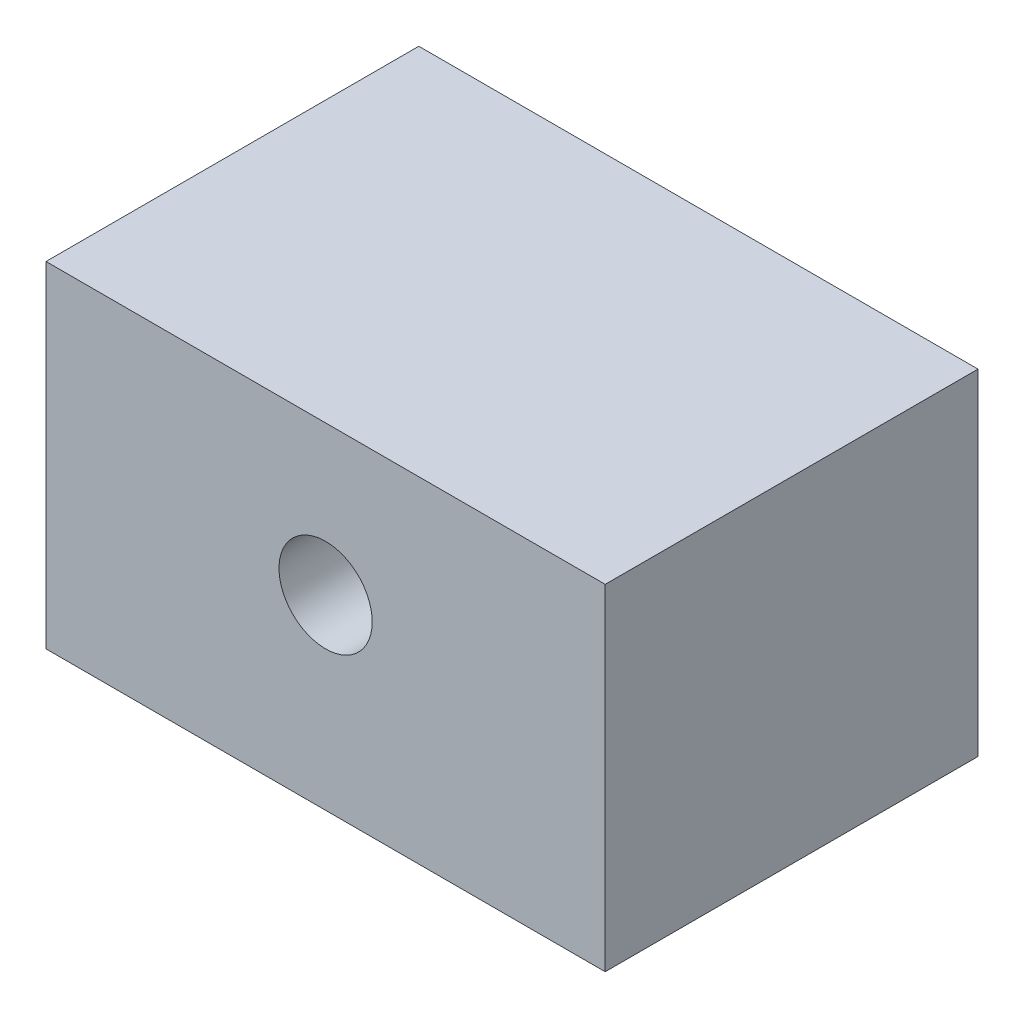
ISO-10303-21;
HEADER;
FILE_DESCRIPTION(('STEP AP214'),'2;1');
FILE_NAME('part.step','',(''),(''),'','','');
FILE_SCHEMA(('AUTOMOTIVE_DESIGN { 1 0 10303 214 1 1 1 1 }'));
ENDSEC;
DATA;
#1=APPLICATION_CONTEXT('core data for automotive mechanical design processes');
#2=APPLICATION_PROTOCOL_DEFINITION('international standard','automotive_design',2000,#1);
#3=PRODUCT_CONTEXT('',#1,'mechanical');
#4=PRODUCT('Part','Part','',(#3));
#5=PRODUCT_RELATED_PRODUCT_CATEGORY('part','',(#4));
#6=PRODUCT_DEFINITION_FORMATION('','',#4);
#7=PRODUCT_DEFINITION_CONTEXT('part definition',#1,'design');
#8=PRODUCT_DEFINITION('design','',#6,#7);
#9=PRODUCT_DEFINITION_SHAPE('','',#8);
#10=(LENGTH_UNIT() NAMED_UNIT(*) SI_UNIT(.MILLI.,.METRE.));
#11=(NAMED_UNIT(*) PLANE_ANGLE_UNIT() SI_UNIT($,.RADIAN.));
#12=(NAMED_UNIT(*) SI_UNIT($,.STERADIAN.) SOLID_ANGLE_UNIT());
#13=UNCERTAINTY_MEASURE_WITH_UNIT(LENGTH_MEASURE(1.E-05),#10,'distance_accuracy_value','');
#14=(GEOMETRIC_REPRESENTATION_CONTEXT(3) GLOBAL_UNCERTAINTY_ASSIGNED_CONTEXT((#13)) GLOBAL_UNIT_ASSIGNED_CONTEXT((#10,
#11,#12)) REPRESENTATION_CONTEXT('',''));
#15=CARTESIAN_POINT('',(0.,0.,0.));
#16=DIRECTION('',(0.,0.,1.));
#17=DIRECTION('',(1.,0.,0.));
#18=AXIS2_PLACEMENT_3D('',#15,#16,#17);
#19=CARTESIAN_POINT('',(15.,18.,10.));
#20=DIRECTION('',(-1.,0.,0.));
#21=DIRECTION('',(0.,0.,1.));
#22=AXIS2_PLACEMENT_3D('',#19,#20,#21);
#23=PLANE('',#22);
#24=DIRECTION('',(0.,0.,-1.));
#25=VECTOR('',#24,1.);
#26=CARTESIAN_POINT('',(15.,0.,10.));
#27=LINE('',#26,#25);
#28=CARTESIAN_POINT('',(15.,0.,10.));
#29=VERTEX_POINT('',#28);
#30=CARTESIAN_POINT('',(15.,0.,-10.));
#31=VERTEX_POINT('',#30);
#32=EDGE_CURVE('E106',#29,#31,#27,.T.);
#33=ORIENTED_EDGE('',*,*,#32,.T.);
#34=DIRECTION('',(0.,-1.,0.));
#35=VECTOR('',#34,1.);
#36=CARTESIAN_POINT('',(15.,18.,-10.));
#37=LINE('',#36,#35);
#38=CARTESIAN_POINT('',(15.,18.,-10.));
#39=VERTEX_POINT('',#38);
#40=EDGE_CURVE('E11',#39,#31,#37,.T.);
#41=ORIENTED_EDGE('',*,*,#40,.F.);
#42=DIRECTION('',(0.,0.,-1.));
#43=VECTOR('',#42,1.);
#44=CARTESIAN_POINT('',(15.,18.,10.));
#45=LINE('',#44,#43);
#46=CARTESIAN_POINT('',(15.,18.,10.));
#47=VERTEX_POINT('',#46);
#48=EDGE_CURVE('E90',#47,#39,#45,.T.);
#49=ORIENTED_EDGE('',*,*,#48,.F.);
#50=DIRECTION('',(0.,-1.,0.));
#51=VECTOR('',#50,1.);
#52=CARTESIAN_POINT('',(15.,18.,10.));
#53=LINE('',#52,#51);
#54=EDGE_CURVE('E102',#47,#29,#53,.T.);
#55=ORIENTED_EDGE('',*,*,#54,.T.);
#56=EDGE_LOOP('',(#33,#41,#49,#55));
#57=FACE_BOUND('',#56,.T.);
#58=ADVANCED_FACE('F38',(#57),#23,.F.);
#59=CARTESIAN_POINT('',(-15.,18.,-10.));
#60=DIRECTION('',(0.,0.,1.));
#61=DIRECTION('',(1.,0.,0.));
#62=AXIS2_PLACEMENT_3D('',#59,#60,#61);
#63=PLANE('',#62);
#64=CARTESIAN_POINT('',(0.,10.,-10.));
#65=DIRECTION('',(0.,0.,1.));
#66=DIRECTION('',(1.,0.,0.));
#67=AXIS2_PLACEMENT_3D('',#64,#65,#66);
#68=CIRCLE('',#67,2.5);
#69=CARTESIAN_POINT('',(2.5,10.,-10.));
#70=VERTEX_POINT('',#69);
#71=EDGE_CURVE('E110',#70,#70,#68,.T.);
#72=ORIENTED_EDGE('',*,*,#71,.T.);
#73=EDGE_LOOP('',(#72));
#74=FACE_BOUND('',#73,.T.);
#75=DIRECTION('',(-1.,0.,0.));
#76=VECTOR('',#75,1.);
#77=CARTESIAN_POINT('',(-15.,0.,-10.));
#78=LINE('',#77,#76);
#79=CARTESIAN_POINT('',(-15.,0.,-10.));
#80=VERTEX_POINT('',#79);
#81=EDGE_CURVE('E95',#31,#80,#78,.T.);
#82=ORIENTED_EDGE('',*,*,#81,.T.);
#83=DIRECTION('',(0.,-1.,0.));
#84=VECTOR('',#83,1.);
#85=CARTESIAN_POINT('',(-15.,18.,-10.));
#86=LINE('',#85,#84);
#87=CARTESIAN_POINT('',(-15.,18.,-10.));
#88=VERTEX_POINT('',#87);
#89=EDGE_CURVE('E47',#88,#80,#86,.T.);
#90=ORIENTED_EDGE('',*,*,#89,.F.);
#91=DIRECTION('',(-1.,0.,0.));
#92=VECTOR('',#91,1.);
#93=CARTESIAN_POINT('',(-15.,18.,-10.));
#94=LINE('',#93,#92);
#95=EDGE_CURVE('E85',#39,#88,#94,.T.);
#96=ORIENTED_EDGE('',*,*,#95,.F.);
#97=ORIENTED_EDGE('',*,*,#40,.T.);
#98=EDGE_LOOP('',(#82,#90,#96,#97));
#99=FACE_BOUND('',#98,.T.);
#100=ADVANCED_FACE('F94',(#74,#99),#63,.F.);
#101=CARTESIAN_POINT('',(-15.,18.,10.));
#102=DIRECTION('',(1.,0.,0.));
#103=DIRECTION('',(0.,0.,-1.));
#104=AXIS2_PLACEMENT_3D('',#101,#102,#103);
#105=PLANE('',#104);
#106=DIRECTION('',(0.,0.,1.));
#107=VECTOR('',#106,1.);
#108=CARTESIAN_POINT('',(-15.,0.,10.));
#109=LINE('',#108,#107);
#110=CARTESIAN_POINT('',(-15.,0.,10.));
#111=VERTEX_POINT('',#110);
#112=EDGE_CURVE('E72',#80,#111,#109,.T.);
#113=ORIENTED_EDGE('',*,*,#112,.T.);
#114=DIRECTION('',(0.,-1.,0.));
#115=VECTOR('',#114,1.);
#116=CARTESIAN_POINT('',(-15.,18.,10.));
#117=LINE('',#116,#115);
#118=CARTESIAN_POINT('',(-15.,18.,10.));
#119=VERTEX_POINT('',#118);
#120=EDGE_CURVE('E97',#119,#111,#117,.T.);
#121=ORIENTED_EDGE('',*,*,#120,.F.);
#122=DIRECTION('',(0.,0.,1.));
#123=VECTOR('',#122,1.);
#124=CARTESIAN_POINT('',(-15.,18.,10.));
#125=LINE('',#124,#123);
#126=EDGE_CURVE('E88',#88,#119,#125,.T.);
#127=ORIENTED_EDGE('',*,*,#126,.F.);
#128=ORIENTED_EDGE('',*,*,#89,.T.);
#129=EDGE_LOOP('',(#113,#121,#127,#128));
#130=FACE_BOUND('',#129,.T.);
#131=ADVANCED_FACE('F98',(#130),#105,.F.);
#132=CARTESIAN_POINT('',(-15.,18.,10.));
#133=DIRECTION('',(0.,0.,-1.));
#134=DIRECTION('',(-1.,0.,0.));
#135=AXIS2_PLACEMENT_3D('',#132,#133,#134);
#136=PLANE('',#135);
#137=CARTESIAN_POINT('',(0.,10.,10.));
#138=DIRECTION('',(0.,0.,1.));
#139=DIRECTION('',(1.,0.,0.));
#140=AXIS2_PLACEMENT_3D('',#137,#138,#139);
#141=CIRCLE('',#140,2.5);
#142=CARTESIAN_POINT('',(2.5,10.,10.));
#143=VERTEX_POINT('',#142);
#144=EDGE_CURVE('E127',#143,#143,#141,.T.);
#145=ORIENTED_EDGE('',*,*,#144,.F.);
#146=EDGE_LOOP('',(#145));
#147=FACE_BOUND('',#146,.T.);
#148=DIRECTION('',(1.,0.,0.));
#149=VECTOR('',#148,1.);
#150=CARTESIAN_POINT('',(-15.,0.,10.));
#151=LINE('',#150,#149);
#152=EDGE_CURVE('E78',#111,#29,#151,.T.);
#153=ORIENTED_EDGE('',*,*,#152,.T.);
#154=ORIENTED_EDGE('',*,*,#54,.F.);
#155=DIRECTION('',(1.,0.,0.));
#156=VECTOR('',#155,1.);
#157=CARTESIAN_POINT('',(-15.,18.,10.));
#158=LINE('',#157,#156);
#159=EDGE_CURVE('E55',#119,#47,#158,.T.);
#160=ORIENTED_EDGE('',*,*,#159,.F.);
#161=ORIENTED_EDGE('',*,*,#120,.T.);
#162=EDGE_LOOP('',(#153,#154,#160,#161));
#163=FACE_BOUND('',#162,.T.);
#164=ADVANCED_FACE('F120',(#147,#163),#136,.F.);
#165=CARTESIAN_POINT('',(0.,18.,0.));
#166=DIRECTION('',(0.,-1.,0.));
#167=DIRECTION('',(0.,0.,-1.));
#168=AXIS2_PLACEMENT_3D('',#165,#166,#167);
#169=PLANE('',#168);
#170=ORIENTED_EDGE('',*,*,#48,.T.);
#171=ORIENTED_EDGE('',*,*,#95,.T.);
#172=ORIENTED_EDGE('',*,*,#126,.T.);
#173=ORIENTED_EDGE('',*,*,#159,.T.);
#174=EDGE_LOOP('',(#170,#171,#172,#173));
#175=FACE_BOUND('',#174,.T.);
#176=ADVANCED_FACE('F86',(#175),#169,.F.);
#177=CARTESIAN_POINT('',(0.,0.,0.));
#178=DIRECTION('',(0.,-1.,0.));
#179=DIRECTION('',(0.,0.,-1.));
#180=AXIS2_PLACEMENT_3D('',#177,#178,#179);
#181=PLANE('',#180);
#182=ORIENTED_EDGE('',*,*,#32,.F.);
#183=ORIENTED_EDGE('',*,*,#152,.F.);
#184=ORIENTED_EDGE('',*,*,#112,.F.);
#185=ORIENTED_EDGE('',*,*,#81,.F.);
#186=EDGE_LOOP('',(#182,#183,#184,#185));
#187=FACE_BOUND('',#186,.T.);
#188=ADVANCED_FACE('F123',(#187),#181,.T.);
#189=CARTESIAN_POINT('',(0.,10.,-10.));
#190=DIRECTION('',(0.,0.,1.));
#191=DIRECTION('',(1.,0.,0.));
#192=AXIS2_PLACEMENT_3D('',#189,#190,#191);
#193=CYLINDRICAL_SURFACE('',#192,2.5);
#194=ORIENTED_EDGE('',*,*,#71,.F.);
#195=EDGE_LOOP('',(#194));
#196=FACE_BOUND('',#195,.T.);
#197=ORIENTED_EDGE('',*,*,#144,.T.);
#198=EDGE_LOOP('',(#197));
#199=FACE_BOUND('',#198,.T.);
#200=ADVANCED_FACE('F136',(#196,#199),#193,.F.);
#201=CLOSED_SHELL('',(#58,#100,#131,#164,#176,#188,#200));
#202=MANIFOLD_SOLID_BREP('B2',#201);
#203=ADVANCED_BREP_SHAPE_REPRESENTATION('',(#18,#202),#14);
#204=SHAPE_DEFINITION_REPRESENTATION(#9,#203);
ENDSEC;
END-ISO-10303-21;
